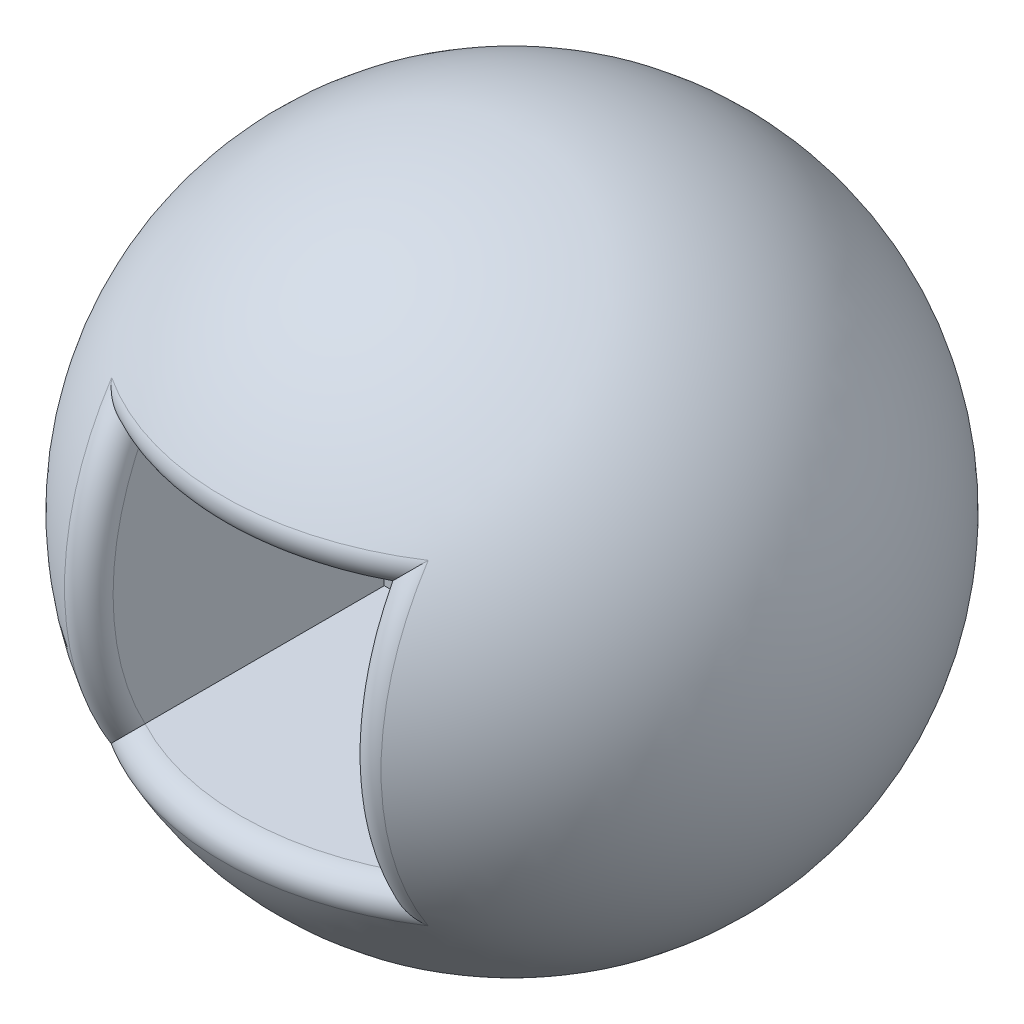
ISO-10303-21;
HEADER;
FILE_DESCRIPTION(('STEP AP214'),'2;1');
FILE_NAME('part.step','',(''),(''),'','','');
FILE_SCHEMA(('AUTOMOTIVE_DESIGN { 1 0 10303 214 1 1 1 1 }'));
ENDSEC;
DATA;
#1=APPLICATION_CONTEXT('core data for automotive mechanical design processes');
#2=APPLICATION_PROTOCOL_DEFINITION('international standard','automotive_design',2000,#1);
#3=PRODUCT_CONTEXT('',#1,'mechanical');
#4=PRODUCT('Part','Part','',(#3));
#5=PRODUCT_RELATED_PRODUCT_CATEGORY('part','',(#4));
#6=PRODUCT_DEFINITION_FORMATION('','',#4);
#7=PRODUCT_DEFINITION_CONTEXT('part definition',#1,'design');
#8=PRODUCT_DEFINITION('design','',#6,#7);
#9=PRODUCT_DEFINITION_SHAPE('','',#8);
#10=(LENGTH_UNIT() NAMED_UNIT(*) SI_UNIT(.MILLI.,.METRE.));
#11=(NAMED_UNIT(*) PLANE_ANGLE_UNIT() SI_UNIT($,.RADIAN.));
#12=(NAMED_UNIT(*) SI_UNIT($,.STERADIAN.) SOLID_ANGLE_UNIT());
#13=UNCERTAINTY_MEASURE_WITH_UNIT(LENGTH_MEASURE(1.E-05),#10,'distance_accuracy_value','');
#14=(GEOMETRIC_REPRESENTATION_CONTEXT(3) GLOBAL_UNCERTAINTY_ASSIGNED_CONTEXT((#13)) GLOBAL_UNIT_ASSIGNED_CONTEXT((#10,
#11,#12)) REPRESENTATION_CONTEXT('',''));
#15=CARTESIAN_POINT('',(0.,0.,0.));
#16=DIRECTION('',(0.,0.,1.));
#17=DIRECTION('',(1.,0.,0.));
#18=AXIS2_PLACEMENT_3D('',#15,#16,#17);
#19=CARTESIAN_POINT('',(0.,0.,0.));
#20=DIRECTION('',(0.,1.,0.));
#21=DIRECTION('',(1.,0.,0.));
#22=AXIS2_PLACEMENT_3D('',#19,#20,#21);
#23=SPHERICAL_SURFACE('',#22,8.);
#24=CARTESIAN_POINT('',(3.84,0.,0.));
#25=DIRECTION('',(-1.,0.,0.));
#26=DIRECTION('',(0.,-1.,0.));
#27=AXIS2_PLACEMENT_3D('',#24,#25,#26);
#28=CIRCLE('',#27,7.01814790382762);
#29=CARTESIAN_POINT('',(3.84,3.84,5.87441912021946));
#30=VERTEX_POINT('',#29);
#31=CARTESIAN_POINT('',(3.84,-3.84,5.87441912021946));
#32=VERTEX_POINT('',#31);
#33=EDGE_CURVE('E122',#30,#32,#28,.F.);
#34=ORIENTED_EDGE('',*,*,#33,.T.);
#35=CARTESIAN_POINT('',(0.,-3.84,0.));
#36=DIRECTION('',(0.,1.,0.));
#37=DIRECTION('',(0.,0.,1.));
#38=AXIS2_PLACEMENT_3D('',#35,#36,#37);
#39=CIRCLE('',#38,7.01814790382762);
#40=CARTESIAN_POINT('',(-3.84,-3.84,5.87441912021946));
#41=VERTEX_POINT('',#40);
#42=EDGE_CURVE('E124',#32,#41,#39,.F.);
#43=ORIENTED_EDGE('',*,*,#42,.T.);
#44=CARTESIAN_POINT('',(-3.84,0.,0.));
#45=DIRECTION('',(1.,0.,0.));
#46=DIRECTION('',(0.,0.,-1.));
#47=AXIS2_PLACEMENT_3D('',#44,#45,#46);
#48=CIRCLE('',#47,7.01814790382762);
#49=CARTESIAN_POINT('',(-3.84,3.84,5.87441912021946));
#50=VERTEX_POINT('',#49);
#51=EDGE_CURVE('E116',#41,#50,#48,.F.);
#52=ORIENTED_EDGE('',*,*,#51,.T.);
#53=CARTESIAN_POINT('',(0.,3.84,0.));
#54=DIRECTION('',(0.,-1.,0.));
#55=DIRECTION('',(0.,0.,-1.));
#56=AXIS2_PLACEMENT_3D('',#53,#54,#55);
#57=CIRCLE('',#56,7.01814790382762);
#58=EDGE_CURVE('E114',#50,#30,#57,.F.);
#59=ORIENTED_EDGE('',*,*,#58,.T.);
#60=EDGE_LOOP('',(#34,#43,#52,#59));
#61=FACE_BOUND('',#60,.T.);
#62=ADVANCED_FACE('F32',(#61),#23,.T.);
#63=CARTESIAN_POINT('',(-3.1,3.1,-8.76812408671319));
#64=DIRECTION('',(-1.,0.,0.));
#65=DIRECTION('',(0.,0.,1.));
#66=AXIS2_PLACEMENT_3D('',#63,#64,#65);
#67=PLANE('',#66);
#68=DIRECTION('',(0.,0.,1.));
#69=VECTOR('',#68,1.);
#70=CARTESIAN_POINT('',(-3.1,3.1,-8.76812408671319));
#71=LINE('',#70,#69);
#72=CARTESIAN_POINT('',(-3.1,3.1,0.));
#73=VERTEX_POINT('',#72);
#74=CARTESIAN_POINT('',(-3.1,3.1,5.80344725141876));
#75=VERTEX_POINT('',#74);
#76=EDGE_CURVE('E99',#73,#75,#71,.T.);
#77=ORIENTED_EDGE('',*,*,#76,.T.);
#78=CARTESIAN_POINT('',(-3.1,0.,0.));
#79=DIRECTION('',(-1.,0.,0.));
#80=DIRECTION('',(0.,0.,1.));
#81=AXIS2_PLACEMENT_3D('',#78,#79,#80);
#82=CIRCLE('',#81,6.57951365983839);
#83=CARTESIAN_POINT('',(-3.1,-3.1,5.80344725141876));
#84=VERTEX_POINT('',#83);
#85=EDGE_CURVE('E45',#75,#84,#82,.F.);
#86=ORIENTED_EDGE('',*,*,#85,.T.);
#87=DIRECTION('',(0.,0.,1.));
#88=VECTOR('',#87,1.);
#89=CARTESIAN_POINT('',(-3.1,-3.1,-8.76812408671319));
#90=LINE('',#89,#88);
#91=CARTESIAN_POINT('',(-3.1,-3.1,0.));
#92=VERTEX_POINT('',#91);
#93=EDGE_CURVE('E109',#92,#84,#90,.T.);
#94=ORIENTED_EDGE('',*,*,#93,.F.);
#95=DIRECTION('',(0.,1.,0.));
#96=VECTOR('',#95,1.);
#97=CARTESIAN_POINT('',(-3.1,3.1,0.));
#98=LINE('',#97,#96);
#99=EDGE_CURVE('E112',#92,#73,#98,.T.);
#100=ORIENTED_EDGE('',*,*,#99,.T.);
#101=EDGE_LOOP('',(#77,#86,#94,#100));
#102=FACE_BOUND('',#101,.T.);
#103=ADVANCED_FACE('F162',(#102),#67,.F.);
#104=CARTESIAN_POINT('',(-3.1,3.1,-8.76812408671319));
#105=DIRECTION('',(0.,1.,0.));
#106=DIRECTION('',(0.,0.,1.));
#107=AXIS2_PLACEMENT_3D('',#104,#105,#106);
#108=PLANE('',#107);
#109=DIRECTION('',(0.,0.,1.));
#110=VECTOR('',#109,1.);
#111=CARTESIAN_POINT('',(3.1,3.1,-8.76812408671319));
#112=LINE('',#111,#110);
#113=CARTESIAN_POINT('',(3.1,3.1,0.));
#114=VERTEX_POINT('',#113);
#115=CARTESIAN_POINT('',(3.1,3.1,5.80344725141876));
#116=VERTEX_POINT('',#115);
#117=EDGE_CURVE('E94',#114,#116,#112,.T.);
#118=ORIENTED_EDGE('',*,*,#117,.T.);
#119=CARTESIAN_POINT('',(0.,3.1,0.));
#120=DIRECTION('',(0.,1.,0.));
#121=DIRECTION('',(0.,0.,1.));
#122=AXIS2_PLACEMENT_3D('',#119,#120,#121);
#123=CIRCLE('',#122,6.57951365983839);
#124=EDGE_CURVE('E11',#116,#75,#123,.F.);
#125=ORIENTED_EDGE('',*,*,#124,.T.);
#126=ORIENTED_EDGE('',*,*,#76,.F.);
#127=DIRECTION('',(1.,0.,0.));
#128=VECTOR('',#127,1.);
#129=CARTESIAN_POINT('',(-3.1,3.1,0.));
#130=LINE('',#129,#128);
#131=EDGE_CURVE('E98',#73,#114,#130,.T.);
#132=ORIENTED_EDGE('',*,*,#131,.T.);
#133=EDGE_LOOP('',(#118,#125,#126,#132));
#134=FACE_BOUND('',#133,.T.);
#135=ADVANCED_FACE('F167',(#134),#108,.F.);
#136=CARTESIAN_POINT('',(3.1,3.1,-8.76812408671319));
#137=DIRECTION('',(1.,0.,0.));
#138=DIRECTION('',(0.,1.,0.));
#139=AXIS2_PLACEMENT_3D('',#136,#137,#138);
#140=PLANE('',#139);
#141=DIRECTION('',(0.,0.,1.));
#142=VECTOR('',#141,1.);
#143=CARTESIAN_POINT('',(3.1,-3.1,-8.76812408671319));
#144=LINE('',#143,#142);
#145=CARTESIAN_POINT('',(3.1,-3.1,0.));
#146=VERTEX_POINT('',#145);
#147=CARTESIAN_POINT('',(3.1,-3.1,5.80344725141876));
#148=VERTEX_POINT('',#147);
#149=EDGE_CURVE('E93',#146,#148,#144,.T.);
#150=ORIENTED_EDGE('',*,*,#149,.T.);
#151=CARTESIAN_POINT('',(3.1,0.,0.));
#152=DIRECTION('',(1.,0.,0.));
#153=DIRECTION('',(0.,1.,0.));
#154=AXIS2_PLACEMENT_3D('',#151,#152,#153);
#155=CIRCLE('',#154,6.57951365983839);
#156=EDGE_CURVE('E59',#148,#116,#155,.F.);
#157=ORIENTED_EDGE('',*,*,#156,.T.);
#158=ORIENTED_EDGE('',*,*,#117,.F.);
#159=DIRECTION('',(0.,-1.,0.));
#160=VECTOR('',#159,1.);
#161=CARTESIAN_POINT('',(3.1,3.1,0.));
#162=LINE('',#161,#160);
#163=EDGE_CURVE('E90',#114,#146,#162,.T.);
#164=ORIENTED_EDGE('',*,*,#163,.T.);
#165=EDGE_LOOP('',(#150,#157,#158,#164));
#166=FACE_BOUND('',#165,.T.);
#167=ADVANCED_FACE('F92',(#166),#140,.F.);
#168=CARTESIAN_POINT('',(-3.1,-3.1,-8.76812408671319));
#169=DIRECTION('',(0.,-1.,0.));
#170=DIRECTION('',(0.,0.,-1.));
#171=AXIS2_PLACEMENT_3D('',#168,#169,#170);
#172=PLANE('',#171);
#173=ORIENTED_EDGE('',*,*,#93,.T.);
#174=CARTESIAN_POINT('',(0.,-3.1,0.));
#175=DIRECTION('',(0.,-1.,0.));
#176=DIRECTION('',(0.,0.,-1.));
#177=AXIS2_PLACEMENT_3D('',#174,#175,#176);
#178=CIRCLE('',#177,6.57951365983839);
#179=EDGE_CURVE('E108',#84,#148,#178,.F.);
#180=ORIENTED_EDGE('',*,*,#179,.T.);
#181=ORIENTED_EDGE('',*,*,#149,.F.);
#182=DIRECTION('',(-1.,0.,0.));
#183=VECTOR('',#182,1.);
#184=CARTESIAN_POINT('',(-3.1,-3.1,0.));
#185=LINE('',#184,#183);
#186=EDGE_CURVE('E105',#146,#92,#185,.T.);
#187=ORIENTED_EDGE('',*,*,#186,.T.);
#188=EDGE_LOOP('',(#173,#180,#181,#187));
#189=FACE_BOUND('',#188,.T.);
#190=ADVANCED_FACE('F104',(#189),#172,.F.);
#191=CARTESIAN_POINT('',(0.,0.,0.));
#192=DIRECTION('',(0.,0.,1.));
#193=DIRECTION('',(1.,0.,0.));
#194=AXIS2_PLACEMENT_3D('',#191,#192,#193);
#195=PLANE('',#194);
#196=ORIENTED_EDGE('',*,*,#99,.F.);
#197=ORIENTED_EDGE('',*,*,#186,.F.);
#198=ORIENTED_EDGE('',*,*,#163,.F.);
#199=ORIENTED_EDGE('',*,*,#131,.F.);
#200=EDGE_LOOP('',(#196,#197,#198,#199));
#201=FACE_BOUND('',#200,.T.);
#202=ADVANCED_FACE('F111',(#201),#195,.T.);
#203=CARTESIAN_POINT('',(0.,3.6,0.));
#204=DIRECTION('',(0.,1.,0.));
#205=DIRECTION('',(0.,0.,1.));
#206=AXIS2_PLACEMENT_3D('',#203,#204,#205);
#207=TOROIDAL_SURFACE('',#206,6.57951365983839,0.5);
#208=CARTESIAN_POINT('',(-3.1,3.1,5.80344725141876));
#209=CARTESIAN_POINT('',(-3.09998678711125,3.09998678711125,5.82302284455378));
#210=CARTESIAN_POINT('',(-3.10089415104775,3.10089415104775,5.84266043799427));
#211=CARTESIAN_POINT('',(-3.10477440845968,3.10477440845968,5.88164099747448));
#212=CARTESIAN_POINT('',(-3.10776037140256,3.10776037140256,5.90098130345682));
#213=CARTESIAN_POINT('',(-3.11605322192177,3.11605322192177,5.93880206302185));
#214=CARTESIAN_POINT('',(-3.12137423563469,3.12137423563469,5.95727651364324));
#215=CARTESIAN_POINT('',(-3.13433538175417,3.13433538175417,5.99245316885848));
#216=CARTESIAN_POINT('',(-3.1419675573853,3.1419675573853,6.00916119269731));
#217=CARTESIAN_POINT('',(-3.15861657810707,3.15861657810707,6.03896024222383));
#218=CARTESIAN_POINT('',(-3.16746974206923,3.16746974206923,6.05223512048377));
#219=CARTESIAN_POINT('',(-3.18663063639323,3.18663063639323,6.07650717297379));
#220=CARTESIAN_POINT('',(-3.1969400973706,3.1969400973706,6.0875015982521));
#221=CARTESIAN_POINT('',(-3.21868180499427,3.21868180499427,6.10713610524854));
#222=CARTESIAN_POINT('',(-3.23011905970046,3.23011905970046,6.11576497756187));
#223=CARTESIAN_POINT('',(-3.25372356023447,3.25372356023447,6.13067514551622));
#224=CARTESIAN_POINT('',(-3.26589093578382,3.26589093578382,6.13695602254407));
#225=CARTESIAN_POINT('',(-3.29773360754621,3.29773360754621,6.15029835703613));
#226=CARTESIAN_POINT('',(-3.31774286089525,3.31774286089525,6.15577173965428));
#227=CARTESIAN_POINT('',(-3.35812450593876,3.35812450593876,6.16216233868363));
#228=CARTESIAN_POINT('',(-3.37849771389441,3.37849771389441,6.16306754146367));
#229=CARTESIAN_POINT('',(-3.4286396079665,3.4286396079665,6.16057939622254));
#230=CARTESIAN_POINT('',(-3.45835157010644,3.45835157010644,6.15498054836683));
#231=CARTESIAN_POINT('',(-3.51678896629308,3.51678896629308,6.1373314303223));
#232=CARTESIAN_POINT('',(-3.54551221362559,3.54551221362559,6.12526772956107));
#233=CARTESIAN_POINT('',(-3.61388920947996,3.61388920947996,6.08947883747011));
#234=CARTESIAN_POINT('',(-3.65281051673492,3.65281051673492,6.06295952920695));
#235=CARTESIAN_POINT('',(-3.72709439031133,3.72709439031133,6.00158717928558));
#236=CARTESIAN_POINT('',(-3.76246037532144,3.76246037532144,5.96674225431962));
#237=CARTESIAN_POINT('',(-3.81010498822562,3.81010498822562,5.91215134502822));
#238=CARTESIAN_POINT('',(-3.82401237274987,3.82401237274987,5.8951780587747));
#239=CARTESIAN_POINT('',(-3.83836180979304,3.83836180979304,5.87655686262377));
#240=CARTESIAN_POINT('',(-3.83918160504377,3.83918160504377,5.87548905985881));
#241=CARTESIAN_POINT('',(-3.84,3.84,5.87441912021946));
#242=B_SPLINE_CURVE_WITH_KNOTS('',3,(#208,#209,#210,#211,#212,#213,#214,#215,#216,#217,#218,
#219,#220,#221,#222,#223,#224,#225,#226,#227,#228,#229,#230,#231,#232,#233,#234,#235,#236,#237,
#238,#239,#240,#241),.UNSPECIFIED.,.F.,.F.,(4,2,2,2,2,2,2,2,2,2,2,2,2,2,2,2,4),(0.,
0.0587780637882706,0.117929080461512,0.177442979567111,0.236754272143838,0.291228631950718,
0.345768280584892,0.400562070956373,0.455365625604252,0.541341401210713,0.627543162879478,
0.754012237931394,0.880745073727862,1.06307242802323,1.24522275042343,1.32311993365207,
1.32784845289398),.UNSPECIFIED.);
#243=EDGE_CURVE('E240',#75,#50,#242,.T.);
#244=ORIENTED_EDGE('',*,*,#243,.F.);
#245=ORIENTED_EDGE('',*,*,#124,.F.);
#246=CARTESIAN_POINT('',(3.1,3.1,5.80344725141876));
#247=CARTESIAN_POINT('',(3.09998678711125,3.09998678711125,5.82302284455378));
#248=CARTESIAN_POINT('',(3.10089415104775,3.10089415104775,5.84266043799426));
#249=CARTESIAN_POINT('',(3.10477440845968,3.10477440845968,5.88164099747448));
#250=CARTESIAN_POINT('',(3.10776037140256,3.10776037140256,5.90098130345682));
#251=CARTESIAN_POINT('',(3.11605322192177,3.11605322192177,5.93880206302185));
#252=CARTESIAN_POINT('',(3.12137423563469,3.12137423563469,5.95727651364324));
#253=CARTESIAN_POINT('',(3.13433538175417,3.13433538175417,5.99245316885848));
#254=CARTESIAN_POINT('',(3.1419675573853,3.1419675573853,6.00916119269731));
#255=CARTESIAN_POINT('',(3.15861657810707,3.15861657810707,6.03896024222383));
#256=CARTESIAN_POINT('',(3.16746974206923,3.16746974206923,6.05223512048377));
#257=CARTESIAN_POINT('',(3.18663063639323,3.18663063639323,6.07650717297378));
#258=CARTESIAN_POINT('',(3.1969400973706,3.1969400973706,6.0875015982521));
#259=CARTESIAN_POINT('',(3.21868180499427,3.21868180499427,6.10713610524854));
#260=CARTESIAN_POINT('',(3.23011905970046,3.23011905970046,6.11576497756187));
#261=CARTESIAN_POINT('',(3.25372356023446,3.25372356023446,6.13067514551621));
#262=CARTESIAN_POINT('',(3.26589093578381,3.26589093578381,6.13695602254407));
#263=CARTESIAN_POINT('',(3.29773360754621,3.29773360754621,6.15029835703612));
#264=CARTESIAN_POINT('',(3.31774286089525,3.31774286089525,6.15577173965428));
#265=CARTESIAN_POINT('',(3.35812450593876,3.35812450593876,6.16216233868362));
#266=CARTESIAN_POINT('',(3.37849771389441,3.37849771389441,6.16306754146367));
#267=CARTESIAN_POINT('',(3.42863960796649,3.42863960796649,6.16057939622254));
#268=CARTESIAN_POINT('',(3.45835157010644,3.45835157010644,6.15498054836683));
#269=CARTESIAN_POINT('',(3.51678896629308,3.51678896629308,6.13733143032231));
#270=CARTESIAN_POINT('',(3.54551221362558,3.54551221362558,6.12526772956107));
#271=CARTESIAN_POINT('',(3.61388920947996,3.61388920947995,6.08947883747011));
#272=CARTESIAN_POINT('',(3.65281051673492,3.6528105167349,6.06295952920696));
#273=CARTESIAN_POINT('',(3.72709439031131,3.72709439031133,6.00158717928558));
#274=CARTESIAN_POINT('',(3.76246037532141,3.76246037532146,5.96674225431962));
#275=CARTESIAN_POINT('',(3.81010498822563,3.81010498822561,5.91215134502823));
#276=CARTESIAN_POINT('',(3.8240123727499,3.82401237274984,5.89517805877471));
#277=CARTESIAN_POINT('',(3.83836180979305,3.83836180979304,5.87655686262377));
#278=CARTESIAN_POINT('',(3.83918160504378,3.83918160504377,5.87548905985881));
#279=CARTESIAN_POINT('',(3.84,3.84,5.87441912021946));
#280=B_SPLINE_CURVE_WITH_KNOTS('',3,(#246,#247,#248,#249,#250,#251,#252,#253,#254,#255,#256,
#257,#258,#259,#260,#261,#262,#263,#264,#265,#266,#267,#268,#269,#270,#271,#272,#273,#274,#275,
#276,#277,#278,#279),.UNSPECIFIED.,.F.,.F.,(4,2,2,2,2,2,2,2,2,2,2,2,2,2,2,2,4),(0.,
0.0587780637882697,0.117929080461511,0.17744297956711,0.236754272143837,0.291228631950718,
0.34576828058489,0.40056207095637,0.455365625604249,0.541341401210709,0.627543162879472,
0.754012237931388,0.880745073727854,1.06307242802322,1.24522275042342,1.32311993365207,
1.32784845289398),.UNSPECIFIED.);
#281=EDGE_CURVE('E37',#30,#116,#280,.F.);
#282=ORIENTED_EDGE('',*,*,#281,.F.);
#283=ORIENTED_EDGE('',*,*,#58,.F.);
#284=EDGE_LOOP('',(#244,#245,#282,#283));
#285=FACE_BOUND('',#284,.T.);
#286=ADVANCED_FACE('F34',(#285),#207,.T.);
#287=CARTESIAN_POINT('',(3.6,0.,0.));
#288=DIRECTION('',(1.,0.,0.));
#289=DIRECTION('',(0.,1.,0.));
#290=AXIS2_PLACEMENT_3D('',#287,#288,#289);
#291=TOROIDAL_SURFACE('',#290,6.57951365983839,0.5);
#292=ORIENTED_EDGE('',*,*,#281,.T.);
#293=ORIENTED_EDGE('',*,*,#156,.F.);
#294=CARTESIAN_POINT('',(3.1,-3.1,5.80344725141876));
#295=CARTESIAN_POINT('',(3.09998678711125,-3.09998678711125,5.82302284455378));
#296=CARTESIAN_POINT('',(3.10089415104776,-3.10089415104775,5.84266043799426));
#297=CARTESIAN_POINT('',(3.10477440845968,-3.10477440845968,5.88164099747448));
#298=CARTESIAN_POINT('',(3.10776037140256,-3.10776037140256,5.90098130345681));
#299=CARTESIAN_POINT('',(3.11605322192177,-3.11605322192177,5.93880206302185));
#300=CARTESIAN_POINT('',(3.12137423563469,-3.12137423563469,5.95727651364324));
#301=CARTESIAN_POINT('',(3.13433538175417,-3.13433538175417,5.99245316885848));
#302=CARTESIAN_POINT('',(3.1419675573853,-3.1419675573853,6.00916119269731));
#303=CARTESIAN_POINT('',(3.15861657810707,-3.15861657810707,6.03896024222383));
#304=CARTESIAN_POINT('',(3.16746974206923,-3.16746974206923,6.05223512048377));
#305=CARTESIAN_POINT('',(3.18663063639323,-3.18663063639323,6.07650717297378));
#306=CARTESIAN_POINT('',(3.1969400973706,-3.1969400973706,6.0875015982521));
#307=CARTESIAN_POINT('',(3.21868180499427,-3.21868180499427,6.10713610524854));
#308=CARTESIAN_POINT('',(3.23011905970046,-3.23011905970046,6.11576497756187));
#309=CARTESIAN_POINT('',(3.25372356023446,-3.25372356023446,6.13067514551621));
#310=CARTESIAN_POINT('',(3.26589093578382,-3.26589093578381,6.13695602254406));
#311=CARTESIAN_POINT('',(3.29773360754621,-3.29773360754621,6.15029835703612));
#312=CARTESIAN_POINT('',(3.31774286089525,-3.31774286089525,6.15577173965428));
#313=CARTESIAN_POINT('',(3.35812450593876,-3.35812450593876,6.16216233868362));
#314=CARTESIAN_POINT('',(3.37849771389441,-3.3784977138944,6.16306754146367));
#315=CARTESIAN_POINT('',(3.4286396079665,-3.42863960796649,6.16057939622254));
#316=CARTESIAN_POINT('',(3.45835157010644,-3.45835157010644,6.15498054836683));
#317=CARTESIAN_POINT('',(3.51678896629308,-3.51678896629308,6.1373314303223));
#318=CARTESIAN_POINT('',(3.54551221362558,-3.54551221362558,6.12526772956107));
#319=CARTESIAN_POINT('',(3.61388920947996,-3.61388920947996,6.08947883747011));
#320=CARTESIAN_POINT('',(3.65281051673491,-3.65281051673492,6.06295952920696));
#321=CARTESIAN_POINT('',(3.72709439031133,-3.72709439031131,6.00158717928558));
#322=CARTESIAN_POINT('',(3.76246037532146,-3.76246037532141,5.96674225431963));
#323=CARTESIAN_POINT('',(3.81010498822561,-3.81010498822563,5.91215134502823));
#324=CARTESIAN_POINT('',(3.82401237274984,-3.82401237274989,5.89517805877471));
#325=CARTESIAN_POINT('',(3.83836180979304,-3.83836180979305,5.87655686262377));
#326=CARTESIAN_POINT('',(3.83918160504377,-3.83918160504378,5.87548905985881));
#327=CARTESIAN_POINT('',(3.84,-3.84,5.87441912021946));
#328=B_SPLINE_CURVE_WITH_KNOTS('',3,(#294,#295,#296,#297,#298,#299,#300,#301,#302,#303,#304,
#305,#306,#307,#308,#309,#310,#311,#312,#313,#314,#315,#316,#317,#318,#319,#320,#321,#322,#323,
#324,#325,#326,#327),.UNSPECIFIED.,.F.,.F.,(4,2,2,2,2,2,2,2,2,2,2,2,2,2,2,2,4),(0.,
0.0587780637882689,0.117929080461511,0.177442979567109,0.236754272143837,0.291228631950718,
0.34576828058489,0.400562070956371,0.455365625604249,0.541341401210709,0.627543162879472,
0.754012237931388,0.880745073727855,1.06307242802322,1.24522275042342,1.32311993365207,
1.32784845289398),.UNSPECIFIED.);
#329=EDGE_CURVE('E137',#32,#148,#328,.F.);
#330=ORIENTED_EDGE('',*,*,#329,.F.);
#331=ORIENTED_EDGE('',*,*,#33,.F.);
#332=EDGE_LOOP('',(#292,#293,#330,#331));
#333=FACE_BOUND('',#332,.T.);
#334=ADVANCED_FACE('F148',(#333),#291,.T.);
#335=CARTESIAN_POINT('',(-3.6,0.,0.));
#336=DIRECTION('',(-1.,0.,0.));
#337=DIRECTION('',(0.,0.,1.));
#338=AXIS2_PLACEMENT_3D('',#335,#336,#337);
#339=TOROIDAL_SURFACE('',#338,6.57951365983839,0.5);
#340=ORIENTED_EDGE('',*,*,#243,.T.);
#341=ORIENTED_EDGE('',*,*,#51,.F.);
#342=CARTESIAN_POINT('',(-3.1,-3.1,5.80344725141876));
#343=CARTESIAN_POINT('',(-3.09998678711125,-3.09998678711125,5.82302284455378));
#344=CARTESIAN_POINT('',(-3.10089415104775,-3.10089415104775,5.84266043799427));
#345=CARTESIAN_POINT('',(-3.10477440845968,-3.10477440845968,5.88164099747448));
#346=CARTESIAN_POINT('',(-3.10776037140256,-3.10776037140256,5.90098130345682));
#347=CARTESIAN_POINT('',(-3.11605322192177,-3.11605322192177,5.93880206302185));
#348=CARTESIAN_POINT('',(-3.12137423563469,-3.12137423563469,5.95727651364324));
#349=CARTESIAN_POINT('',(-3.13433538175417,-3.13433538175417,5.99245316885848));
#350=CARTESIAN_POINT('',(-3.1419675573853,-3.1419675573853,6.00916119269731));
#351=CARTESIAN_POINT('',(-3.15861657810707,-3.15861657810707,6.03896024222383));
#352=CARTESIAN_POINT('',(-3.16746974206923,-3.16746974206923,6.05223512048377));
#353=CARTESIAN_POINT('',(-3.18663063639323,-3.18663063639323,6.07650717297379));
#354=CARTESIAN_POINT('',(-3.1969400973706,-3.1969400973706,6.0875015982521));
#355=CARTESIAN_POINT('',(-3.21868180499427,-3.21868180499427,6.10713610524854));
#356=CARTESIAN_POINT('',(-3.23011905970046,-3.23011905970046,6.11576497756187));
#357=CARTESIAN_POINT('',(-3.25372356023447,-3.25372356023447,6.13067514551622));
#358=CARTESIAN_POINT('',(-3.26589093578382,-3.26589093578382,6.13695602254407));
#359=CARTESIAN_POINT('',(-3.29773360754621,-3.29773360754621,6.15029835703613));
#360=CARTESIAN_POINT('',(-3.31774286089525,-3.31774286089525,6.15577173965428));
#361=CARTESIAN_POINT('',(-3.35812450593876,-3.35812450593876,6.16216233868363));
#362=CARTESIAN_POINT('',(-3.37849771389441,-3.37849771389441,6.16306754146367));
#363=CARTESIAN_POINT('',(-3.4286396079665,-3.4286396079665,6.16057939622254));
#364=CARTESIAN_POINT('',(-3.45835157010644,-3.45835157010644,6.15498054836683));
#365=CARTESIAN_POINT('',(-3.51678896629308,-3.51678896629308,6.1373314303223));
#366=CARTESIAN_POINT('',(-3.54551221362559,-3.54551221362559,6.12526772956107));
#367=CARTESIAN_POINT('',(-3.61388920947996,-3.61388920947996,6.08947883747011));
#368=CARTESIAN_POINT('',(-3.65281051673492,-3.65281051673492,6.06295952920695));
#369=CARTESIAN_POINT('',(-3.72709439031133,-3.72709439031133,6.00158717928558));
#370=CARTESIAN_POINT('',(-3.76246037532144,-3.76246037532144,5.96674225431962));
#371=CARTESIAN_POINT('',(-3.81010498822562,-3.81010498822562,5.91215134502822));
#372=CARTESIAN_POINT('',(-3.82401237274987,-3.82401237274987,5.8951780587747));
#373=CARTESIAN_POINT('',(-3.83836180979304,-3.83836180979304,5.87655686262377));
#374=CARTESIAN_POINT('',(-3.83918160504377,-3.83918160504377,5.87548905985881));
#375=CARTESIAN_POINT('',(-3.84,-3.84,5.87441912021946));
#376=B_SPLINE_CURVE_WITH_KNOTS('',3,(#342,#343,#344,#345,#346,#347,#348,#349,#350,#351,#352,
#353,#354,#355,#356,#357,#358,#359,#360,#361,#362,#363,#364,#365,#366,#367,#368,#369,#370,#371,
#372,#373,#374,#375),.UNSPECIFIED.,.F.,.F.,(4,2,2,2,2,2,2,2,2,2,2,2,2,2,2,2,4),(0.,
0.0587780637882706,0.117929080461512,0.177442979567111,0.236754272143838,0.291228631950718,
0.345768280584892,0.400562070956373,0.455365625604252,0.541341401210713,0.627543162879478,
0.754012237931394,0.880745073727862,1.06307242802323,1.24522275042343,1.32311993365207,
1.32784845289398),.UNSPECIFIED.);
#377=EDGE_CURVE('E130',#84,#41,#376,.T.);
#378=ORIENTED_EDGE('',*,*,#377,.F.);
#379=ORIENTED_EDGE('',*,*,#85,.F.);
#380=EDGE_LOOP('',(#340,#341,#378,#379));
#381=FACE_BOUND('',#380,.T.);
#382=ADVANCED_FACE('F141',(#381),#339,.T.);
#383=CARTESIAN_POINT('',(0.,-3.6,0.));
#384=DIRECTION('',(0.,-1.,0.));
#385=DIRECTION('',(0.,0.,-1.));
#386=AXIS2_PLACEMENT_3D('',#383,#384,#385);
#387=TOROIDAL_SURFACE('',#386,6.57951365983839,0.5);
#388=ORIENTED_EDGE('',*,*,#329,.T.);
#389=ORIENTED_EDGE('',*,*,#179,.F.);
#390=ORIENTED_EDGE('',*,*,#377,.T.);
#391=ORIENTED_EDGE('',*,*,#42,.F.);
#392=EDGE_LOOP('',(#388,#389,#390,#391));
#393=FACE_BOUND('',#392,.T.);
#394=ADVANCED_FACE('F144',(#393),#387,.T.);
#395=CLOSED_SHELL('',(#62,#103,#135,#167,#190,#202,#286,#334,#382,#394));
#396=MANIFOLD_SOLID_BREP('B2',#395);
#397=ADVANCED_BREP_SHAPE_REPRESENTATION('',(#18,#396),#14);
#398=SHAPE_DEFINITION_REPRESENTATION(#9,#397);
ENDSEC;
END-ISO-10303-21;
